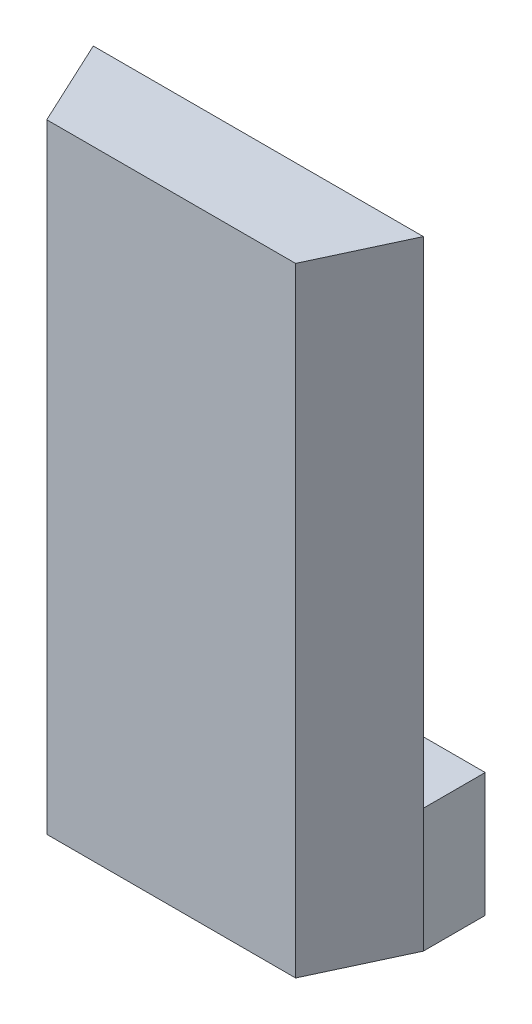
ISO-10303-21;
HEADER;
FILE_DESCRIPTION(('STEP AP214'),'2;1');
FILE_NAME('part.step','',(''),(''),'','','');
FILE_SCHEMA(('AUTOMOTIVE_DESIGN { 1 0 10303 214 1 1 1 1 }'));
ENDSEC;
DATA;
#1=APPLICATION_CONTEXT('core data for automotive mechanical design processes');
#2=APPLICATION_PROTOCOL_DEFINITION('international standard','automotive_design',2000,#1);
#3=PRODUCT_CONTEXT('',#1,'mechanical');
#4=PRODUCT('Part','Part','',(#3));
#5=PRODUCT_RELATED_PRODUCT_CATEGORY('part','',(#4));
#6=PRODUCT_DEFINITION_FORMATION('','',#4);
#7=PRODUCT_DEFINITION_CONTEXT('part definition',#1,'design');
#8=PRODUCT_DEFINITION('design','',#6,#7);
#9=PRODUCT_DEFINITION_SHAPE('','',#8);
#10=(LENGTH_UNIT() NAMED_UNIT(*) SI_UNIT(.MILLI.,.METRE.));
#11=(NAMED_UNIT(*) PLANE_ANGLE_UNIT() SI_UNIT($,.RADIAN.));
#12=(NAMED_UNIT(*) SI_UNIT($,.STERADIAN.) SOLID_ANGLE_UNIT());
#13=UNCERTAINTY_MEASURE_WITH_UNIT(LENGTH_MEASURE(1.E-05),#10,'distance_accuracy_value','');
#14=(GEOMETRIC_REPRESENTATION_CONTEXT(3) GLOBAL_UNCERTAINTY_ASSIGNED_CONTEXT((#13)) GLOBAL_UNIT_ASSIGNED_CONTEXT((#10,
#11,#12)) REPRESENTATION_CONTEXT('',''));
#15=CARTESIAN_POINT('',(0.,0.,0.));
#16=DIRECTION('',(0.,0.,1.));
#17=DIRECTION('',(1.,0.,0.));
#18=AXIS2_PLACEMENT_3D('',#15,#16,#17);
#19=CARTESIAN_POINT('',(-8.,15.,0.));
#20=DIRECTION('',(1.,0.,0.));
#21=DIRECTION('',(0.,0.,-1.));
#22=AXIS2_PLACEMENT_3D('',#19,#20,#21);
#23=PLANE('',#22);
#24=DIRECTION('',(0.,0.,1.));
#25=VECTOR('',#24,1.);
#26=CARTESIAN_POINT('',(-8.,3.,0.));
#27=LINE('',#26,#25);
#28=CARTESIAN_POINT('',(-8.,3.,0.));
#29=VERTEX_POINT('',#28);
#30=CARTESIAN_POINT('',(-8.,3.,1.5));
#31=VERTEX_POINT('',#30);
#32=EDGE_CURVE('E110',#29,#31,#27,.T.);
#33=ORIENTED_EDGE('',*,*,#32,.F.);
#34=DIRECTION('',(0.,-1.,0.));
#35=VECTOR('',#34,1.);
#36=CARTESIAN_POINT('',(-8.,15.,0.));
#37=LINE('',#36,#35);
#38=CARTESIAN_POINT('',(-8.,0.,0.));
#39=VERTEX_POINT('',#38);
#40=EDGE_CURVE('E83',#29,#39,#37,.T.);
#41=ORIENTED_EDGE('',*,*,#40,.T.);
#42=DIRECTION('',(0.,0.,1.));
#43=VECTOR('',#42,1.);
#44=CARTESIAN_POINT('',(-8.,0.,0.));
#45=LINE('',#44,#43);
#46=CARTESIAN_POINT('',(-8.,0.,1.5));
#47=VERTEX_POINT('',#46);
#48=EDGE_CURVE('E118',#39,#47,#45,.T.);
#49=ORIENTED_EDGE('',*,*,#48,.T.);
#50=DIRECTION('',(0.,-1.,0.));
#51=VECTOR('',#50,1.);
#52=CARTESIAN_POINT('',(-8.,15.,1.5));
#53=LINE('',#52,#51);
#54=EDGE_CURVE('E44',#31,#47,#53,.T.);
#55=ORIENTED_EDGE('',*,*,#54,.F.);
#56=EDGE_LOOP('',(#33,#41,#49,#55));
#57=FACE_BOUND('',#56,.T.);
#58=ADVANCED_FACE('F36',(#57),#23,.F.);
#59=CARTESIAN_POINT('',(0.,15.,0.));
#60=DIRECTION('',(-1.,0.,0.));
#61=DIRECTION('',(0.,0.,1.));
#62=AXIS2_PLACEMENT_3D('',#59,#60,#61);
#63=PLANE('',#62);
#64=DIRECTION('',(0.,0.,-1.));
#65=VECTOR('',#64,1.);
#66=CARTESIAN_POINT('',(0.,3.,0.));
#67=LINE('',#66,#65);
#68=CARTESIAN_POINT('',(0.,3.,1.5));
#69=VERTEX_POINT('',#68);
#70=CARTESIAN_POINT('',(0.,3.,0.));
#71=VERTEX_POINT('',#70);
#72=EDGE_CURVE('E109',#69,#71,#67,.T.);
#73=ORIENTED_EDGE('',*,*,#72,.F.);
#74=DIRECTION('',(0.,-1.,0.));
#75=VECTOR('',#74,1.);
#76=CARTESIAN_POINT('',(0.,15.,1.5));
#77=LINE('',#76,#75);
#78=CARTESIAN_POINT('',(0.,0.,1.5));
#79=VERTEX_POINT('',#78);
#80=EDGE_CURVE('E148',#69,#79,#77,.T.);
#81=ORIENTED_EDGE('',*,*,#80,.T.);
#82=DIRECTION('',(0.,0.,-1.));
#83=VECTOR('',#82,1.);
#84=CARTESIAN_POINT('',(0.,0.,0.));
#85=LINE('',#84,#83);
#86=CARTESIAN_POINT('',(0.,0.,0.));
#87=VERTEX_POINT('',#86);
#88=EDGE_CURVE('E131',#79,#87,#85,.T.);
#89=ORIENTED_EDGE('',*,*,#88,.T.);
#90=DIRECTION('',(0.,-1.,0.));
#91=VECTOR('',#90,1.);
#92=CARTESIAN_POINT('',(0.,15.,0.));
#93=LINE('',#92,#91);
#94=EDGE_CURVE('E76',#71,#87,#93,.T.);
#95=ORIENTED_EDGE('',*,*,#94,.F.);
#96=EDGE_LOOP('',(#73,#81,#89,#95));
#97=FACE_BOUND('',#96,.T.);
#98=ADVANCED_FACE('F175',(#97),#63,.F.);
#99=CARTESIAN_POINT('',(0.,15.,0.));
#100=DIRECTION('',(0.,0.,1.));
#101=DIRECTION('',(1.,0.,0.));
#102=AXIS2_PLACEMENT_3D('',#99,#100,#101);
#103=PLANE('',#102);
#104=DIRECTION('',(-1.,0.,0.));
#105=VECTOR('',#104,1.);
#106=CARTESIAN_POINT('',(-8.,3.,0.));
#107=LINE('',#106,#105);
#108=EDGE_CURVE('E114',#71,#29,#107,.T.);
#109=ORIENTED_EDGE('',*,*,#108,.F.);
#110=ORIENTED_EDGE('',*,*,#94,.T.);
#111=DIRECTION('',(-1.,0.,0.));
#112=VECTOR('',#111,1.);
#113=CARTESIAN_POINT('',(0.,0.,0.));
#114=LINE('',#113,#112);
#115=EDGE_CURVE('E127',#87,#39,#114,.T.);
#116=ORIENTED_EDGE('',*,*,#115,.T.);
#117=ORIENTED_EDGE('',*,*,#40,.F.);
#118=EDGE_LOOP('',(#109,#110,#116,#117));
#119=FACE_BOUND('',#118,.T.);
#120=ADVANCED_FACE('F179',(#119),#103,.F.);
#121=CARTESIAN_POINT('',(-7.1456837710854,15.,3.33208706521099));
#122=DIRECTION('',(0.906307787036651,0.,-0.422618261740697));
#123=DIRECTION('',(-0.422618261740697,0.,-0.906307787036651));
#124=AXIS2_PLACEMENT_3D('',#121,#122,#123);
#125=PLANE('',#124);
#126=DIRECTION('',(0.422618261740697,0.,0.906307787036651));
#127=VECTOR('',#126,1.);
#128=CARTESIAN_POINT('',(-7.1456837710854,0.,3.33208706521099));
#129=LINE('',#128,#127);
#130=CARTESIAN_POINT('',(-7.01540532078035,0.,3.61147010348345));
#131=VERTEX_POINT('',#130);
#132=EDGE_CURVE('E138',#47,#131,#129,.T.);
#133=ORIENTED_EDGE('',*,*,#132,.T.);
#134=DIRECTION('',(0.,-1.,0.));
#135=VECTOR('',#134,1.);
#136=CARTESIAN_POINT('',(-7.01540532078035,15.,3.61147010348345));
#137=LINE('',#136,#135);
#138=CARTESIAN_POINT('',(-7.01540532078035,15.,3.61147010348345));
#139=VERTEX_POINT('',#138);
#140=EDGE_CURVE('E121',#139,#131,#137,.T.);
#141=ORIENTED_EDGE('',*,*,#140,.F.);
#142=DIRECTION('',(0.422618261740697,0.,0.906307787036651));
#143=VECTOR('',#142,1.);
#144=CARTESIAN_POINT('',(-7.1456837710854,15.,3.33208706521099));
#145=LINE('',#144,#143);
#146=CARTESIAN_POINT('',(-8.,15.,1.5));
#147=VERTEX_POINT('',#146);
#148=EDGE_CURVE('E125',#147,#139,#145,.T.);
#149=ORIENTED_EDGE('',*,*,#148,.F.);
#150=EDGE_CURVE('E11',#147,#31,#53,.T.);
#151=ORIENTED_EDGE('',*,*,#150,.T.);
#152=ORIENTED_EDGE('',*,*,#54,.T.);
#153=EDGE_LOOP('',(#133,#141,#149,#151,#152));
#154=FACE_BOUND('',#153,.T.);
#155=ADVANCED_FACE('F123',(#154),#125,.F.);
#156=CARTESIAN_POINT('',(0.,15.,3.61147010348345));
#157=DIRECTION('',(0.,0.,-1.));
#158=DIRECTION('',(-1.,0.,0.));
#159=AXIS2_PLACEMENT_3D('',#156,#157,#158);
#160=PLANE('',#159);
#161=DIRECTION('',(1.,0.,0.));
#162=VECTOR('',#161,1.);
#163=CARTESIAN_POINT('',(0.,0.,3.61147010348345));
#164=LINE('',#163,#162);
#165=CARTESIAN_POINT('',(-0.984594679219651,0.,3.61147010348345));
#166=VERTEX_POINT('',#165);
#167=EDGE_CURVE('E140',#131,#166,#164,.T.);
#168=ORIENTED_EDGE('',*,*,#167,.T.);
#169=DIRECTION('',(0.,-1.,0.));
#170=VECTOR('',#169,1.);
#171=CARTESIAN_POINT('',(-0.984594679219651,15.,3.61147010348345));
#172=LINE('',#171,#170);
#173=CARTESIAN_POINT('',(-0.984594679219651,15.,3.61147010348345));
#174=VERTEX_POINT('',#173);
#175=EDGE_CURVE('E150',#174,#166,#172,.T.);
#176=ORIENTED_EDGE('',*,*,#175,.F.);
#177=DIRECTION('',(1.,0.,0.));
#178=VECTOR('',#177,1.);
#179=CARTESIAN_POINT('',(0.,15.,3.61147010348345));
#180=LINE('',#179,#178);
#181=EDGE_CURVE('E52',#139,#174,#180,.T.);
#182=ORIENTED_EDGE('',*,*,#181,.F.);
#183=ORIENTED_EDGE('',*,*,#140,.T.);
#184=EDGE_LOOP('',(#168,#176,#182,#183));
#185=FACE_BOUND('',#184,.T.);
#186=ADVANCED_FACE('F154',(#185),#160,.F.);
#187=CARTESIAN_POINT('',(0.574533332339232,15.,0.267909292735093));
#188=DIRECTION('',(-0.906307787036651,0.,-0.422618261740697));
#189=DIRECTION('',(-0.422618261740697,0.,0.906307787036651));
#190=AXIS2_PLACEMENT_3D('',#187,#188,#189);
#191=PLANE('',#190);
#192=DIRECTION('',(0.422618261740697,0.,-0.906307787036651));
#193=VECTOR('',#192,1.);
#194=CARTESIAN_POINT('',(0.574533332339232,0.,0.267909292735093));
#195=LINE('',#194,#193);
#196=EDGE_CURVE('E142',#166,#79,#195,.T.);
#197=ORIENTED_EDGE('',*,*,#196,.T.);
#198=ORIENTED_EDGE('',*,*,#80,.F.);
#199=CARTESIAN_POINT('',(0.,15.,1.5));
#200=VERTEX_POINT('',#199);
#201=EDGE_CURVE('E106',#200,#69,#77,.T.);
#202=ORIENTED_EDGE('',*,*,#201,.F.);
#203=DIRECTION('',(0.422618261740697,0.,-0.906307787036651));
#204=VECTOR('',#203,1.);
#205=CARTESIAN_POINT('',(0.574533332339232,15.,0.267909292735093));
#206=LINE('',#205,#204);
#207=EDGE_CURVE('E129',#174,#200,#206,.T.);
#208=ORIENTED_EDGE('',*,*,#207,.F.);
#209=ORIENTED_EDGE('',*,*,#175,.T.);
#210=EDGE_LOOP('',(#197,#198,#202,#208,#209));
#211=FACE_BOUND('',#210,.T.);
#212=ADVANCED_FACE('F162',(#211),#191,.F.);
#213=CARTESIAN_POINT('',(0.,15.,0.));
#214=DIRECTION('',(0.,1.,0.));
#215=DIRECTION('',(0.,0.,1.));
#216=AXIS2_PLACEMENT_3D('',#213,#214,#215);
#217=PLANE('',#216);
#218=DIRECTION('',(1.,0.,0.));
#219=VECTOR('',#218,1.);
#220=CARTESIAN_POINT('',(-8.,15.,1.5));
#221=LINE('',#220,#219);
#222=EDGE_CURVE('E115',#147,#200,#221,.T.);
#223=ORIENTED_EDGE('',*,*,#222,.F.);
#224=ORIENTED_EDGE('',*,*,#148,.T.);
#225=ORIENTED_EDGE('',*,*,#181,.T.);
#226=ORIENTED_EDGE('',*,*,#207,.T.);
#227=EDGE_LOOP('',(#223,#224,#225,#226));
#228=FACE_BOUND('',#227,.T.);
#229=ADVANCED_FACE('F164',(#228),#217,.T.);
#230=CARTESIAN_POINT('',(0.,0.,0.));
#231=DIRECTION('',(0.,1.,0.));
#232=DIRECTION('',(0.,0.,1.));
#233=AXIS2_PLACEMENT_3D('',#230,#231,#232);
#234=PLANE('',#233);
#235=ORIENTED_EDGE('',*,*,#48,.F.);
#236=ORIENTED_EDGE('',*,*,#115,.F.);
#237=ORIENTED_EDGE('',*,*,#88,.F.);
#238=ORIENTED_EDGE('',*,*,#196,.F.);
#239=ORIENTED_EDGE('',*,*,#167,.F.);
#240=ORIENTED_EDGE('',*,*,#132,.F.);
#241=EDGE_LOOP('',(#235,#236,#237,#238,#239,#240));
#242=FACE_BOUND('',#241,.T.);
#243=ADVANCED_FACE('F157',(#242),#234,.F.);
#244=CARTESIAN_POINT('',(-8.,3.,1.5));
#245=DIRECTION('',(0.,0.,1.));
#246=DIRECTION('',(1.,0.,0.));
#247=AXIS2_PLACEMENT_3D('',#244,#245,#246);
#248=PLANE('',#247);
#249=ORIENTED_EDGE('',*,*,#222,.T.);
#250=ORIENTED_EDGE('',*,*,#201,.T.);
#251=DIRECTION('',(1.,0.,0.));
#252=VECTOR('',#251,1.);
#253=CARTESIAN_POINT('',(-8.,3.,1.5));
#254=LINE('',#253,#252);
#255=EDGE_CURVE('E102',#31,#69,#254,.T.);
#256=ORIENTED_EDGE('',*,*,#255,.F.);
#257=ORIENTED_EDGE('',*,*,#150,.F.);
#258=EDGE_LOOP('',(#249,#250,#256,#257));
#259=FACE_BOUND('',#258,.T.);
#260=ADVANCED_FACE('F104',(#259),#248,.F.);
#261=CARTESIAN_POINT('',(0.,3.,0.));
#262=DIRECTION('',(0.,1.,0.));
#263=DIRECTION('',(0.,0.,1.));
#264=AXIS2_PLACEMENT_3D('',#261,#262,#263);
#265=PLANE('',#264);
#266=ORIENTED_EDGE('',*,*,#32,.T.);
#267=ORIENTED_EDGE('',*,*,#255,.T.);
#268=ORIENTED_EDGE('',*,*,#72,.T.);
#269=ORIENTED_EDGE('',*,*,#108,.T.);
#270=EDGE_LOOP('',(#266,#267,#268,#269));
#271=FACE_BOUND('',#270,.T.);
#272=ADVANCED_FACE('F113',(#271),#265,.T.);
#273=CLOSED_SHELL('',(#58,#98,#120,#155,#186,#212,#229,#243,#260,#272));
#274=MANIFOLD_SOLID_BREP('B2',#273);
#275=ADVANCED_BREP_SHAPE_REPRESENTATION('',(#18,#274),#14);
#276=SHAPE_DEFINITION_REPRESENTATION(#9,#275);
ENDSEC;
END-ISO-10303-21;
